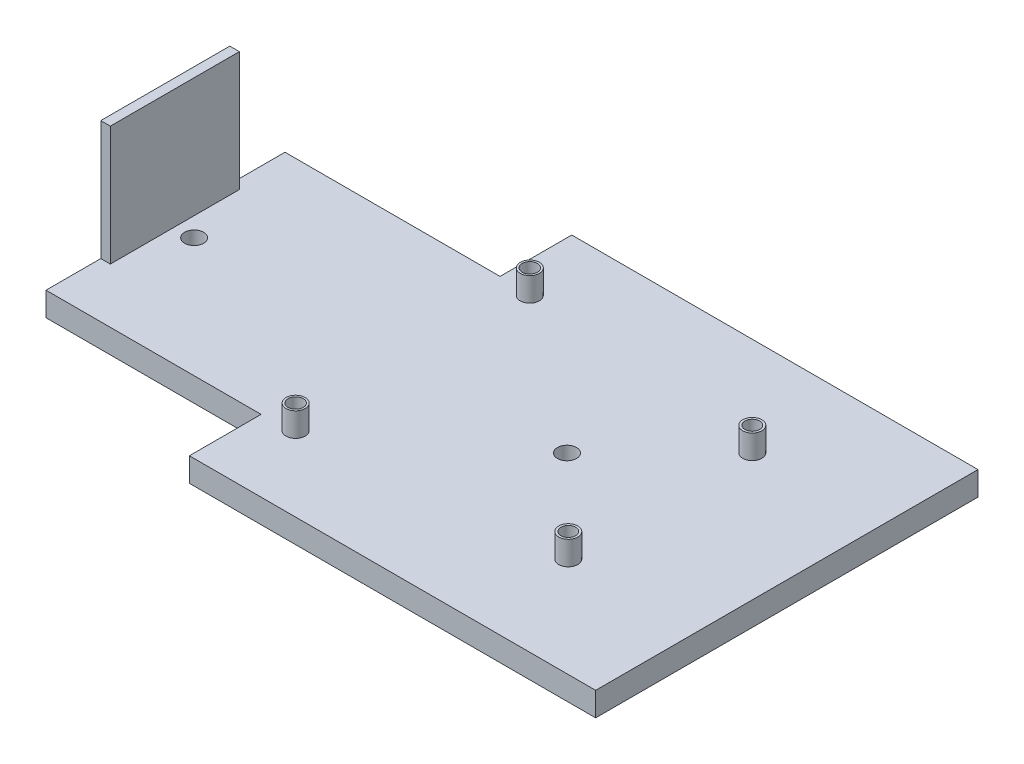
ISO-10303-21;
HEADER;
FILE_DESCRIPTION(('STEP AP214'),'2;1');
FILE_NAME('part.step','',(''),(''),'','','');
FILE_SCHEMA(('AUTOMOTIVE_DESIGN { 1 0 10303 214 1 1 1 1 }'));
ENDSEC;
DATA;
#1=APPLICATION_CONTEXT('core data for automotive mechanical design processes');
#2=APPLICATION_PROTOCOL_DEFINITION('international standard','automotive_design',2000,#1);
#3=PRODUCT_CONTEXT('',#1,'mechanical');
#4=PRODUCT('Part','Part','',(#3));
#5=PRODUCT_RELATED_PRODUCT_CATEGORY('part','',(#4));
#6=PRODUCT_DEFINITION_FORMATION('','',#4);
#7=PRODUCT_DEFINITION_CONTEXT('part definition',#1,'design');
#8=PRODUCT_DEFINITION('design','',#6,#7);
#9=PRODUCT_DEFINITION_SHAPE('','',#8);
#10=(LENGTH_UNIT() NAMED_UNIT(*) SI_UNIT(.MILLI.,.METRE.));
#11=(NAMED_UNIT(*) PLANE_ANGLE_UNIT() SI_UNIT($,.RADIAN.));
#12=(NAMED_UNIT(*) SI_UNIT($,.STERADIAN.) SOLID_ANGLE_UNIT());
#13=UNCERTAINTY_MEASURE_WITH_UNIT(LENGTH_MEASURE(1.E-05),#10,'distance_accuracy_value','');
#14=(GEOMETRIC_REPRESENTATION_CONTEXT(3) GLOBAL_UNCERTAINTY_ASSIGNED_CONTEXT((#13)) GLOBAL_UNIT_ASSIGNED_CONTEXT((#10,
#11,#12)) REPRESENTATION_CONTEXT('',''));
#15=CARTESIAN_POINT('',(0.,0.,0.));
#16=DIRECTION('',(0.,0.,1.));
#17=DIRECTION('',(1.,0.,0.));
#18=AXIS2_PLACEMENT_3D('',#15,#16,#17);
#19=CARTESIAN_POINT('',(0.,5.,0.));
#20=DIRECTION('',(0.,1.,0.));
#21=DIRECTION('',(0.,0.,1.));
#22=AXIS2_PLACEMENT_3D('',#19,#20,#21);
#23=PLANE('',#22);
#24=CARTESIAN_POINT('',(-55.2067460328945,5.,-58.3739284863577));
#25=DIRECTION('',(0.,1.,0.));
#26=DIRECTION('',(0.,0.,1.));
#27=AXIS2_PLACEMENT_3D('',#24,#25,#26);
#28=CIRCLE('',#27,2.);
#29=CARTESIAN_POINT('',(-55.2067460328945,5.,-56.3739284863577));
#30=VERTEX_POINT('',#29);
#31=EDGE_CURVE('E356',#30,#30,#28,.T.);
#32=ORIENTED_EDGE('',*,*,#31,.F.);
#33=EDGE_LOOP('',(#32));
#34=FACE_BOUND('',#33,.T.);
#35=CARTESIAN_POINT('',(-55.2067423314219,5.,-19.8739267393045));
#36=DIRECTION('',(0.,1.,0.));
#37=DIRECTION('',(0.,0.,1.));
#38=AXIS2_PLACEMENT_3D('',#35,#36,#37);
#39=CIRCLE('',#38,2.);
#40=CARTESIAN_POINT('',(-55.2067423314219,5.,-17.8739267393045));
#41=VERTEX_POINT('',#40);
#42=EDGE_CURVE('E347',#41,#41,#39,.T.);
#43=ORIENTED_EDGE('',*,*,#42,.F.);
#44=EDGE_LOOP('',(#43));
#45=FACE_BOUND('',#44,.T.);
#46=CARTESIAN_POINT('',(-107.006746211613,5.,-14.6239291819976));
#47=DIRECTION('',(0.,1.,0.));
#48=DIRECTION('',(0.,0.,1.));
#49=AXIS2_PLACEMENT_3D('',#46,#47,#48);
#50=CIRCLE('',#49,2.);
#51=CARTESIAN_POINT('',(-107.006746211613,5.,-12.6239291819976));
#52=VERTEX_POINT('',#51);
#53=EDGE_CURVE('E338',#52,#52,#50,.T.);
#54=ORIENTED_EDGE('',*,*,#53,.F.);
#55=EDGE_LOOP('',(#54));
#56=FACE_BOUND('',#55,.T.);
#57=CARTESIAN_POINT('',(-107.006745745952,5.,-63.6239297631429));
#58=DIRECTION('',(0.,1.,0.));
#59=DIRECTION('',(0.,0.,1.));
#60=AXIS2_PLACEMENT_3D('',#57,#58,#59);
#61=CIRCLE('',#60,2.);
#62=CARTESIAN_POINT('',(-107.006745745952,5.,-61.6239297631429));
#63=VERTEX_POINT('',#62);
#64=EDGE_CURVE('E328',#63,#63,#61,.T.);
#65=ORIENTED_EDGE('',*,*,#64,.F.);
#66=EDGE_LOOP('',(#65));
#67=FACE_BOUND('',#66,.T.);
#68=CARTESIAN_POINT('',(-74.5629921259843,5.,-38.9566929133858));
#69=DIRECTION('',(0.,1.,0.));
#70=DIRECTION('',(0.,0.,1.));
#71=AXIS2_PLACEMENT_3D('',#68,#69,#70);
#72=CIRCLE('',#71,2.);
#73=CARTESIAN_POINT('',(-74.5629921259843,5.,-36.9566929133858));
#74=VERTEX_POINT('',#73);
#75=EDGE_CURVE('E184',#74,#74,#72,.T.);
#76=ORIENTED_EDGE('',*,*,#75,.F.);
#77=EDGE_LOOP('',(#76));
#78=FACE_BOUND('',#77,.T.);
#79=CARTESIAN_POINT('',(-152.562992125984,5.,-38.9566929133858));
#80=DIRECTION('',(0.,1.,0.));
#81=DIRECTION('',(0.,0.,1.));
#82=AXIS2_PLACEMENT_3D('',#79,#80,#81);
#83=CIRCLE('',#82,2.);
#84=CARTESIAN_POINT('',(-152.562992125984,5.,-36.9566929133858));
#85=VERTEX_POINT('',#84);
#86=EDGE_CURVE('E275',#85,#85,#83,.T.);
#87=ORIENTED_EDGE('',*,*,#86,.F.);
#88=EDGE_LOOP('',(#87));
#89=FACE_BOUND('',#88,.T.);
#90=DIRECTION('',(0.,0.,-1.));
#91=VECTOR('',#90,1.);
#92=CARTESIAN_POINT('',(-156.562992125984,5.,-52.4126656965444));
#93=LINE('',#92,#91);
#94=CARTESIAN_POINT('',(-156.562992125984,5.,-25.4126656965444));
#95=VERTEX_POINT('',#94);
#96=CARTESIAN_POINT('',(-156.562992125984,5.,-52.4126656965444));
#97=VERTEX_POINT('',#96);
#98=EDGE_CURVE('E375',#95,#97,#93,.T.);
#99=ORIENTED_EDGE('',*,*,#98,.F.);
#100=DIRECTION('',(1.,0.,0.));
#101=VECTOR('',#100,1.);
#102=CARTESIAN_POINT('',(-156.562992125984,5.,-25.4126656965444));
#103=LINE('',#102,#101);
#104=CARTESIAN_POINT('',(-158.562992125984,5.,-25.4126656965444));
#105=VERTEX_POINT('',#104);
#106=EDGE_CURVE('E377',#105,#95,#103,.T.);
#107=ORIENTED_EDGE('',*,*,#106,.F.);
#108=DIRECTION('',(0.,0.,1.));
#109=VECTOR('',#108,1.);
#110=CARTESIAN_POINT('',(-158.562992125984,5.,-63.9566929133858));
#111=LINE('',#110,#109);
#112=CARTESIAN_POINT('',(-158.562992125984,5.,-13.9566929133858));
#113=VERTEX_POINT('',#112);
#114=EDGE_CURVE('E104',#105,#113,#111,.T.);
#115=ORIENTED_EDGE('',*,*,#114,.T.);
#116=DIRECTION('',(1.,0.,0.));
#117=VECTOR('',#116,1.);
#118=CARTESIAN_POINT('',(-158.562992125984,5.,-13.9566929133858));
#119=LINE('',#118,#117);
#120=CARTESIAN_POINT('',(-113.562992125984,5.,-13.9566929133858));
#121=VERTEX_POINT('',#120);
#122=EDGE_CURVE('E321',#113,#121,#119,.T.);
#123=ORIENTED_EDGE('',*,*,#122,.T.);
#124=DIRECTION('',(0.,0.,1.));
#125=VECTOR('',#124,1.);
#126=CARTESIAN_POINT('',(-113.562992125984,5.,1.04330708661417));
#127=LINE('',#126,#125);
#128=CARTESIAN_POINT('',(-113.562992125984,5.,1.04330708661417));
#129=VERTEX_POINT('',#128);
#130=EDGE_CURVE('E312',#121,#129,#127,.T.);
#131=ORIENTED_EDGE('',*,*,#130,.T.);
#132=DIRECTION('',(1.,0.,0.));
#133=VECTOR('',#132,1.);
#134=CARTESIAN_POINT('',(-28.5629921259842,5.,1.04330708661416));
#135=LINE('',#134,#133);
#136=CARTESIAN_POINT('',(-28.5629921259842,5.,1.04330708661416));
#137=VERTEX_POINT('',#136);
#138=EDGE_CURVE('E317',#129,#137,#135,.T.);
#139=ORIENTED_EDGE('',*,*,#138,.T.);
#140=DIRECTION('',(0.,0.,-1.));
#141=VECTOR('',#140,1.);
#142=CARTESIAN_POINT('',(-28.5629921259842,5.,-78.9566929133858));
#143=LINE('',#142,#141);
#144=CARTESIAN_POINT('',(-28.5629921259842,5.,-78.9566929133858));
#145=VERTEX_POINT('',#144);
#146=EDGE_CURVE('E128',#137,#145,#143,.T.);
#147=ORIENTED_EDGE('',*,*,#146,.T.);
#148=DIRECTION('',(-1.,0.,0.));
#149=VECTOR('',#148,1.);
#150=CARTESIAN_POINT('',(-113.562992125984,5.,-78.9566929133858));
#151=LINE('',#150,#149);
#152=CARTESIAN_POINT('',(-113.562992125984,5.,-78.9566929133858));
#153=VERTEX_POINT('',#152);
#154=EDGE_CURVE('E121',#145,#153,#151,.T.);
#155=ORIENTED_EDGE('',*,*,#154,.T.);
#156=DIRECTION('',(0.,0.,1.));
#157=VECTOR('',#156,1.);
#158=CARTESIAN_POINT('',(-113.562992125984,5.,-63.9566929133858));
#159=LINE('',#158,#157);
#160=CARTESIAN_POINT('',(-113.562992125984,5.,-63.9566929133858));
#161=VERTEX_POINT('',#160);
#162=EDGE_CURVE('E125',#153,#161,#159,.T.);
#163=ORIENTED_EDGE('',*,*,#162,.T.);
#164=DIRECTION('',(-1.,0.,0.));
#165=VECTOR('',#164,1.);
#166=CARTESIAN_POINT('',(-158.562992125984,5.,-63.9566929133858));
#167=LINE('',#166,#165);
#168=CARTESIAN_POINT('',(-158.562992125984,5.,-63.9566929133858));
#169=VERTEX_POINT('',#168);
#170=EDGE_CURVE('E63',#161,#169,#167,.T.);
#171=ORIENTED_EDGE('',*,*,#170,.T.);
#172=CARTESIAN_POINT('',(-158.562992125984,5.,-52.4126656965444));
#173=VERTEX_POINT('',#172);
#174=EDGE_CURVE('E284',#169,#173,#111,.T.);
#175=ORIENTED_EDGE('',*,*,#174,.T.);
#176=DIRECTION('',(-1.,0.,0.));
#177=VECTOR('',#176,1.);
#178=CARTESIAN_POINT('',(-158.562992125984,5.,-52.4126656965444));
#179=LINE('',#178,#177);
#180=EDGE_CURVE('E372',#97,#173,#179,.T.);
#181=ORIENTED_EDGE('',*,*,#180,.F.);
#182=EDGE_LOOP('',(#99,#107,#115,#123,#131,#139,#147,#155,#163,#171,#175,#181));
#183=FACE_BOUND('',#182,.T.);
#184=ADVANCED_FACE('F39',(#34,#45,#56,#67,#78,#89,#183),#23,.T.);
#185=CARTESIAN_POINT('',(-158.562992125984,5.,-63.9566929133858));
#186=DIRECTION('',(1.,0.,0.));
#187=DIRECTION('',(0.,0.,-1.));
#188=AXIS2_PLACEMENT_3D('',#185,#186,#187);
#189=PLANE('',#188);
#190=DIRECTION('',(0.,0.,1.));
#191=VECTOR('',#190,1.);
#192=CARTESIAN_POINT('',(-158.562992125984,0.,-63.9566929133858));
#193=LINE('',#192,#191);
#194=CARTESIAN_POINT('',(-158.562992125984,0.,-63.9566929133858));
#195=VERTEX_POINT('',#194);
#196=CARTESIAN_POINT('',(-158.562992125984,0.,-13.9566929133858));
#197=VERTEX_POINT('',#196);
#198=EDGE_CURVE('E149',#195,#197,#193,.T.);
#199=ORIENTED_EDGE('',*,*,#198,.T.);
#200=DIRECTION('',(0.,-1.,0.));
#201=VECTOR('',#200,1.);
#202=CARTESIAN_POINT('',(-158.562992125984,5.,-13.9566929133858));
#203=LINE('',#202,#201);
#204=EDGE_CURVE('E177',#113,#197,#203,.T.);
#205=ORIENTED_EDGE('',*,*,#204,.F.);
#206=ORIENTED_EDGE('',*,*,#114,.F.);
#207=DIRECTION('',(0.,-1.,0.));
#208=VECTOR('',#207,1.);
#209=CARTESIAN_POINT('',(-158.562992125984,30.,-25.4126656965444));
#210=LINE('',#209,#208);
#211=CARTESIAN_POINT('',(-158.562992125984,30.,-25.4126656965444));
#212=VERTEX_POINT('',#211);
#213=EDGE_CURVE('E360',#212,#105,#210,.T.);
#214=ORIENTED_EDGE('',*,*,#213,.F.);
#215=DIRECTION('',(0.,0.,1.));
#216=VECTOR('',#215,1.);
#217=CARTESIAN_POINT('',(-158.562992125984,30.,-25.4126656965444));
#218=LINE('',#217,#216);
#219=CARTESIAN_POINT('',(-158.562992125984,30.,-52.4126656965444));
#220=VERTEX_POINT('',#219);
#221=EDGE_CURVE('E374',#220,#212,#218,.T.);
#222=ORIENTED_EDGE('',*,*,#221,.F.);
#223=DIRECTION('',(0.,-1.,0.));
#224=VECTOR('',#223,1.);
#225=CARTESIAN_POINT('',(-158.562992125984,30.,-52.4126656965444));
#226=LINE('',#225,#224);
#227=EDGE_CURVE('E369',#220,#173,#226,.T.);
#228=ORIENTED_EDGE('',*,*,#227,.T.);
#229=ORIENTED_EDGE('',*,*,#174,.F.);
#230=DIRECTION('',(0.,-1.,0.));
#231=VECTOR('',#230,1.);
#232=CARTESIAN_POINT('',(-158.562992125984,5.,-63.9566929133858));
#233=LINE('',#232,#231);
#234=EDGE_CURVE('E145',#169,#195,#233,.T.);
#235=ORIENTED_EDGE('',*,*,#234,.T.);
#236=EDGE_LOOP('',(#199,#205,#206,#214,#222,#228,#229,#235));
#237=FACE_BOUND('',#236,.T.);
#238=ADVANCED_FACE('F41',(#237),#189,.F.);
#239=CARTESIAN_POINT('',(-158.562992125984,5.,-13.9566929133858));
#240=DIRECTION('',(0.,0.,-1.));
#241=DIRECTION('',(-1.,0.,0.));
#242=AXIS2_PLACEMENT_3D('',#239,#240,#241);
#243=PLANE('',#242);
#244=DIRECTION('',(1.,0.,0.));
#245=VECTOR('',#244,1.);
#246=CARTESIAN_POINT('',(-158.562992125984,0.,-13.9566929133858));
#247=LINE('',#246,#245);
#248=CARTESIAN_POINT('',(-113.562992125984,0.,-13.9566929133858));
#249=VERTEX_POINT('',#248);
#250=EDGE_CURVE('E152',#197,#249,#247,.T.);
#251=ORIENTED_EDGE('',*,*,#250,.T.);
#252=DIRECTION('',(0.,-1.,0.));
#253=VECTOR('',#252,1.);
#254=CARTESIAN_POINT('',(-113.562992125984,5.,-13.9566929133858));
#255=LINE('',#254,#253);
#256=EDGE_CURVE('E174',#121,#249,#255,.T.);
#257=ORIENTED_EDGE('',*,*,#256,.F.);
#258=ORIENTED_EDGE('',*,*,#122,.F.);
#259=ORIENTED_EDGE('',*,*,#204,.T.);
#260=EDGE_LOOP('',(#251,#257,#258,#259));
#261=FACE_BOUND('',#260,.T.);
#262=ADVANCED_FACE('F228',(#261),#243,.F.);
#263=CARTESIAN_POINT('',(-113.562992125984,5.,1.04330708661417));
#264=DIRECTION('',(1.,0.,0.));
#265=DIRECTION('',(0.,0.,-1.));
#266=AXIS2_PLACEMENT_3D('',#263,#264,#265);
#267=PLANE('',#266);
#268=DIRECTION('',(0.,0.,1.));
#269=VECTOR('',#268,1.);
#270=CARTESIAN_POINT('',(-113.562992125984,0.,1.04330708661417));
#271=LINE('',#270,#269);
#272=CARTESIAN_POINT('',(-113.562992125984,0.,1.04330708661417));
#273=VERTEX_POINT('',#272);
#274=EDGE_CURVE('E155',#249,#273,#271,.T.);
#275=ORIENTED_EDGE('',*,*,#274,.T.);
#276=DIRECTION('',(0.,-1.,0.));
#277=VECTOR('',#276,1.);
#278=CARTESIAN_POINT('',(-113.562992125984,5.,1.04330708661417));
#279=LINE('',#278,#277);
#280=EDGE_CURVE('E171',#129,#273,#279,.T.);
#281=ORIENTED_EDGE('',*,*,#280,.F.);
#282=ORIENTED_EDGE('',*,*,#130,.F.);
#283=ORIENTED_EDGE('',*,*,#256,.T.);
#284=EDGE_LOOP('',(#275,#281,#282,#283));
#285=FACE_BOUND('',#284,.T.);
#286=ADVANCED_FACE('F301',(#285),#267,.F.);
#287=CARTESIAN_POINT('',(-28.5629921259842,5.,1.04330708661416));
#288=DIRECTION('',(0.,0.,-1.));
#289=DIRECTION('',(-1.,0.,0.));
#290=AXIS2_PLACEMENT_3D('',#287,#288,#289);
#291=PLANE('',#290);
#292=DIRECTION('',(1.,0.,0.));
#293=VECTOR('',#292,1.);
#294=CARTESIAN_POINT('',(-28.5629921259842,0.,1.04330708661416));
#295=LINE('',#294,#293);
#296=CARTESIAN_POINT('',(-28.5629921259842,0.,1.04330708661416));
#297=VERTEX_POINT('',#296);
#298=EDGE_CURVE('E157',#273,#297,#295,.T.);
#299=ORIENTED_EDGE('',*,*,#298,.T.);
#300=DIRECTION('',(0.,-1.,0.));
#301=VECTOR('',#300,1.);
#302=CARTESIAN_POINT('',(-28.5629921259842,5.,1.04330708661416));
#303=LINE('',#302,#301);
#304=EDGE_CURVE('E168',#137,#297,#303,.T.);
#305=ORIENTED_EDGE('',*,*,#304,.F.);
#306=ORIENTED_EDGE('',*,*,#138,.F.);
#307=ORIENTED_EDGE('',*,*,#280,.T.);
#308=EDGE_LOOP('',(#299,#305,#306,#307));
#309=FACE_BOUND('',#308,.T.);
#310=ADVANCED_FACE('F297',(#309),#291,.F.);
#311=CARTESIAN_POINT('',(-28.5629921259842,5.,-78.9566929133858));
#312=DIRECTION('',(-1.,0.,0.));
#313=DIRECTION('',(0.,0.,1.));
#314=AXIS2_PLACEMENT_3D('',#311,#312,#313);
#315=PLANE('',#314);
#316=DIRECTION('',(0.,0.,-1.));
#317=VECTOR('',#316,1.);
#318=CARTESIAN_POINT('',(-28.5629921259842,0.,-78.9566929133858));
#319=LINE('',#318,#317);
#320=CARTESIAN_POINT('',(-28.5629921259842,0.,-78.9566929133858));
#321=VERTEX_POINT('',#320);
#322=EDGE_CURVE('E159',#297,#321,#319,.T.);
#323=ORIENTED_EDGE('',*,*,#322,.T.);
#324=DIRECTION('',(0.,-1.,0.));
#325=VECTOR('',#324,1.);
#326=CARTESIAN_POINT('',(-28.5629921259842,5.,-78.9566929133858));
#327=LINE('',#326,#325);
#328=EDGE_CURVE('E140',#145,#321,#327,.T.);
#329=ORIENTED_EDGE('',*,*,#328,.F.);
#330=ORIENTED_EDGE('',*,*,#146,.F.);
#331=ORIENTED_EDGE('',*,*,#304,.T.);
#332=EDGE_LOOP('',(#323,#329,#330,#331));
#333=FACE_BOUND('',#332,.T.);
#334=ADVANCED_FACE('F294',(#333),#315,.F.);
#335=CARTESIAN_POINT('',(-113.562992125984,5.,-78.9566929133858));
#336=DIRECTION('',(0.,0.,1.));
#337=DIRECTION('',(1.,0.,0.));
#338=AXIS2_PLACEMENT_3D('',#335,#336,#337);
#339=PLANE('',#338);
#340=DIRECTION('',(-1.,0.,0.));
#341=VECTOR('',#340,1.);
#342=CARTESIAN_POINT('',(-113.562992125984,0.,-78.9566929133858));
#343=LINE('',#342,#341);
#344=CARTESIAN_POINT('',(-113.562992125984,0.,-78.9566929133858));
#345=VERTEX_POINT('',#344);
#346=EDGE_CURVE('E137',#321,#345,#343,.T.);
#347=ORIENTED_EDGE('',*,*,#346,.T.);
#348=DIRECTION('',(0.,-1.,0.));
#349=VECTOR('',#348,1.);
#350=CARTESIAN_POINT('',(-113.562992125984,5.,-78.9566929133858));
#351=LINE('',#350,#349);
#352=EDGE_CURVE('E134',#153,#345,#351,.T.);
#353=ORIENTED_EDGE('',*,*,#352,.F.);
#354=ORIENTED_EDGE('',*,*,#154,.F.);
#355=ORIENTED_EDGE('',*,*,#328,.T.);
#356=EDGE_LOOP('',(#347,#353,#354,#355));
#357=FACE_BOUND('',#356,.T.);
#358=ADVANCED_FACE('F135',(#357),#339,.F.);
#359=CARTESIAN_POINT('',(-113.562992125984,5.,-63.9566929133858));
#360=DIRECTION('',(1.,0.,0.));
#361=DIRECTION('',(0.,0.,-1.));
#362=AXIS2_PLACEMENT_3D('',#359,#360,#361);
#363=PLANE('',#362);
#364=DIRECTION('',(0.,0.,1.));
#365=VECTOR('',#364,1.);
#366=CARTESIAN_POINT('',(-113.562992125984,0.,-63.9566929133858));
#367=LINE('',#366,#365);
#368=CARTESIAN_POINT('',(-113.562992125984,0.,-63.9566929133858));
#369=VERTEX_POINT('',#368);
#370=EDGE_CURVE('E162',#345,#369,#367,.T.);
#371=ORIENTED_EDGE('',*,*,#370,.T.);
#372=DIRECTION('',(0.,-1.,0.));
#373=VECTOR('',#372,1.);
#374=CARTESIAN_POINT('',(-113.562992125984,5.,-63.9566929133858));
#375=LINE('',#374,#373);
#376=EDGE_CURVE('E141',#161,#369,#375,.T.);
#377=ORIENTED_EDGE('',*,*,#376,.F.);
#378=ORIENTED_EDGE('',*,*,#162,.F.);
#379=ORIENTED_EDGE('',*,*,#352,.T.);
#380=EDGE_LOOP('',(#371,#377,#378,#379));
#381=FACE_BOUND('',#380,.T.);
#382=ADVANCED_FACE('F143',(#381),#363,.F.);
#383=CARTESIAN_POINT('',(-158.562992125984,5.,-63.9566929133858));
#384=DIRECTION('',(0.,0.,1.));
#385=DIRECTION('',(1.,0.,0.));
#386=AXIS2_PLACEMENT_3D('',#383,#384,#385);
#387=PLANE('',#386);
#388=DIRECTION('',(-1.,0.,0.));
#389=VECTOR('',#388,1.);
#390=CARTESIAN_POINT('',(-158.562992125984,0.,-63.9566929133858));
#391=LINE('',#390,#389);
#392=EDGE_CURVE('E96',#369,#195,#391,.T.);
#393=ORIENTED_EDGE('',*,*,#392,.T.);
#394=ORIENTED_EDGE('',*,*,#234,.F.);
#395=ORIENTED_EDGE('',*,*,#170,.F.);
#396=ORIENTED_EDGE('',*,*,#376,.T.);
#397=EDGE_LOOP('',(#393,#394,#395,#396));
#398=FACE_BOUND('',#397,.T.);
#399=ADVANCED_FACE('F270',(#398),#387,.F.);
#400=CARTESIAN_POINT('',(0.,0.,0.));
#401=DIRECTION('',(0.,1.,0.));
#402=DIRECTION('',(0.,0.,1.));
#403=AXIS2_PLACEMENT_3D('',#400,#401,#402);
#404=PLANE('',#403);
#405=CARTESIAN_POINT('',(-74.5629921259843,0.,-38.9566929133858));
#406=DIRECTION('',(0.,1.,0.));
#407=DIRECTION('',(0.,0.,1.));
#408=AXIS2_PLACEMENT_3D('',#405,#406,#407);
#409=CIRCLE('',#408,2.);
#410=CARTESIAN_POINT('',(-74.5629921259843,0.,-36.9566929133858));
#411=VERTEX_POINT('',#410);
#412=EDGE_CURVE('E153',#411,#411,#409,.T.);
#413=ORIENTED_EDGE('',*,*,#412,.T.);
#414=EDGE_LOOP('',(#413));
#415=FACE_BOUND('',#414,.T.);
#416=CARTESIAN_POINT('',(-152.562992125984,0.,-38.9566929133858));
#417=DIRECTION('',(0.,1.,0.));
#418=DIRECTION('',(0.,0.,1.));
#419=AXIS2_PLACEMENT_3D('',#416,#417,#418);
#420=CIRCLE('',#419,2.);
#421=CARTESIAN_POINT('',(-152.562992125984,0.,-36.9566929133858));
#422=VERTEX_POINT('',#421);
#423=EDGE_CURVE('E181',#422,#422,#420,.T.);
#424=ORIENTED_EDGE('',*,*,#423,.T.);
#425=EDGE_LOOP('',(#424));
#426=FACE_BOUND('',#425,.T.);
#427=ORIENTED_EDGE('',*,*,#198,.F.);
#428=ORIENTED_EDGE('',*,*,#392,.F.);
#429=ORIENTED_EDGE('',*,*,#370,.F.);
#430=ORIENTED_EDGE('',*,*,#346,.F.);
#431=ORIENTED_EDGE('',*,*,#322,.F.);
#432=ORIENTED_EDGE('',*,*,#298,.F.);
#433=ORIENTED_EDGE('',*,*,#274,.F.);
#434=ORIENTED_EDGE('',*,*,#250,.F.);
#435=EDGE_LOOP('',(#427,#428,#429,#430,#431,#432,#433,#434));
#436=FACE_BOUND('',#435,.T.);
#437=ADVANCED_FACE('F265',(#415,#426,#436),#404,.F.);
#438=CARTESIAN_POINT('',(-152.562992125984,-13.,-38.9566929133858));
#439=DIRECTION('',(0.,1.,0.));
#440=DIRECTION('',(0.,0.,1.));
#441=AXIS2_PLACEMENT_3D('',#438,#439,#440);
#442=CYLINDRICAL_SURFACE('',#441,2.);
#443=ORIENTED_EDGE('',*,*,#86,.T.);
#444=EDGE_LOOP('',(#443));
#445=FACE_BOUND('',#444,.T.);
#446=ORIENTED_EDGE('',*,*,#423,.F.);
#447=EDGE_LOOP('',(#446));
#448=FACE_BOUND('',#447,.T.);
#449=ADVANCED_FACE('F262',(#445,#448),#442,.F.);
#450=CARTESIAN_POINT('',(-74.5629921259843,-13.,-38.9566929133858));
#451=DIRECTION('',(0.,1.,0.));
#452=DIRECTION('',(0.,0.,1.));
#453=AXIS2_PLACEMENT_3D('',#450,#451,#452);
#454=CYLINDRICAL_SURFACE('',#453,2.);
#455=ORIENTED_EDGE('',*,*,#75,.T.);
#456=EDGE_LOOP('',(#455));
#457=FACE_BOUND('',#456,.T.);
#458=ORIENTED_EDGE('',*,*,#412,.F.);
#459=EDGE_LOOP('',(#458));
#460=FACE_BOUND('',#459,.T.);
#461=ADVANCED_FACE('F258',(#457,#460),#454,.F.);
#462=CARTESIAN_POINT('',(-107.006745745952,10.,-63.6239297631429));
#463=DIRECTION('',(0.,1.,0.));
#464=DIRECTION('',(0.,0.,1.));
#465=AXIS2_PLACEMENT_3D('',#462,#463,#464);
#466=PLANE('',#465);
#467=CARTESIAN_POINT('',(-107.006745745952,10.,-63.6239297631429));
#468=DIRECTION('',(0.,1.,0.));
#469=DIRECTION('',(0.,0.,1.));
#470=AXIS2_PLACEMENT_3D('',#467,#468,#469);
#471=CIRCLE('',#470,2.);
#472=CARTESIAN_POINT('',(-107.006745745952,10.,-61.6239297631429));
#473=VERTEX_POINT('',#472);
#474=EDGE_CURVE('E325',#473,#473,#471,.T.);
#475=ORIENTED_EDGE('',*,*,#474,.T.);
#476=EDGE_LOOP('',(#475));
#477=FACE_BOUND('',#476,.T.);
#478=CARTESIAN_POINT('',(-107.006745745952,10.,-63.6239297631429));
#479=DIRECTION('',(0.,1.,0.));
#480=DIRECTION('',(0.,0.,1.));
#481=AXIS2_PLACEMENT_3D('',#478,#479,#480);
#482=CIRCLE('',#481,1.59614806761965);
#483=CARTESIAN_POINT('',(-107.006745745952,10.,-62.0277816955232));
#484=VERTEX_POINT('',#483);
#485=EDGE_CURVE('E331',#484,#484,#482,.T.);
#486=ORIENTED_EDGE('',*,*,#485,.F.);
#487=EDGE_LOOP('',(#486));
#488=FACE_BOUND('',#487,.T.);
#489=ADVANCED_FACE('F251',(#477,#488),#466,.T.);
#490=CARTESIAN_POINT('',(-107.006745745952,10.,-63.6239297631429));
#491=DIRECTION('',(0.,-1.,0.));
#492=DIRECTION('',(0.,0.,-1.));
#493=AXIS2_PLACEMENT_3D('',#490,#491,#492);
#494=CYLINDRICAL_SURFACE('',#493,2.);
#495=ORIENTED_EDGE('',*,*,#474,.F.);
#496=EDGE_LOOP('',(#495));
#497=FACE_BOUND('',#496,.T.);
#498=ORIENTED_EDGE('',*,*,#64,.T.);
#499=EDGE_LOOP('',(#498));
#500=FACE_BOUND('',#499,.T.);
#501=ADVANCED_FACE('F243',(#497,#500),#494,.T.);
#502=CARTESIAN_POINT('',(-107.006745745952,10.,-63.6239297631429));
#503=DIRECTION('',(0.,-1.,0.));
#504=DIRECTION('',(0.,0.,-1.));
#505=AXIS2_PLACEMENT_3D('',#502,#503,#504);
#506=CYLINDRICAL_SURFACE('',#505,1.59614806761965);
#507=ORIENTED_EDGE('',*,*,#485,.T.);
#508=EDGE_LOOP('',(#507));
#509=FACE_BOUND('',#508,.T.);
#510=CARTESIAN_POINT('',(-107.006745745952,5.,-63.6239297631429));
#511=DIRECTION('',(0.,1.,0.));
#512=DIRECTION('',(0.,0.,1.));
#513=AXIS2_PLACEMENT_3D('',#510,#511,#512);
#514=CIRCLE('',#513,1.59614806761965);
#515=CARTESIAN_POINT('',(-107.006745745952,5.,-62.0277816955232));
#516=VERTEX_POINT('',#515);
#517=EDGE_CURVE('E180',#516,#516,#514,.F.);
#518=ORIENTED_EDGE('',*,*,#517,.T.);
#519=EDGE_LOOP('',(#518));
#520=FACE_BOUND('',#519,.T.);
#521=ADVANCED_FACE('F234',(#509,#520),#506,.F.);
#522=ORIENTED_EDGE('',*,*,#517,.F.);
#523=EDGE_LOOP('',(#522));
#524=FACE_BOUND('',#523,.T.);
#525=ADVANCED_FACE('F218',(#524),#23,.T.);
#526=CARTESIAN_POINT('',(-107.006746211613,10.,-14.6239291819976));
#527=DIRECTION('',(0.,1.,0.));
#528=DIRECTION('',(0.,0.,1.));
#529=AXIS2_PLACEMENT_3D('',#526,#527,#528);
#530=PLANE('',#529);
#531=CARTESIAN_POINT('',(-107.006746211613,10.,-14.6239291819976));
#532=DIRECTION('',(0.,1.,0.));
#533=DIRECTION('',(0.,0.,1.));
#534=AXIS2_PLACEMENT_3D('',#531,#532,#533);
#535=CIRCLE('',#534,2.);
#536=CARTESIAN_POINT('',(-107.006746211613,10.,-12.6239291819976));
#537=VERTEX_POINT('',#536);
#538=EDGE_CURVE('E339',#537,#537,#535,.T.);
#539=ORIENTED_EDGE('',*,*,#538,.T.);
#540=EDGE_LOOP('',(#539));
#541=FACE_BOUND('',#540,.T.);
#542=CARTESIAN_POINT('',(-107.006746211613,10.,-14.6239291819976));
#543=DIRECTION('',(0.,1.,0.));
#544=DIRECTION('',(0.,0.,1.));
#545=AXIS2_PLACEMENT_3D('',#542,#543,#544);
#546=CIRCLE('',#545,1.5961527156674);
#547=CARTESIAN_POINT('',(-107.006746211613,10.,-13.0277764663302));
#548=VERTEX_POINT('',#547);
#549=EDGE_CURVE('E335',#548,#548,#546,.T.);
#550=ORIENTED_EDGE('',*,*,#549,.F.);
#551=EDGE_LOOP('',(#550));
#552=FACE_BOUND('',#551,.T.);
#553=ADVANCED_FACE('F233',(#541,#552),#530,.T.);
#554=CARTESIAN_POINT('',(-107.006746211613,10.,-14.6239291819976));
#555=DIRECTION('',(0.,-1.,0.));
#556=DIRECTION('',(0.,0.,-1.));
#557=AXIS2_PLACEMENT_3D('',#554,#555,#556);
#558=CYLINDRICAL_SURFACE('',#557,2.);
#559=ORIENTED_EDGE('',*,*,#538,.F.);
#560=EDGE_LOOP('',(#559));
#561=FACE_BOUND('',#560,.T.);
#562=ORIENTED_EDGE('',*,*,#53,.T.);
#563=EDGE_LOOP('',(#562));
#564=FACE_BOUND('',#563,.T.);
#565=ADVANCED_FACE('F240',(#561,#564),#558,.T.);
#566=CARTESIAN_POINT('',(-107.006746211613,10.,-14.6239291819976));
#567=DIRECTION('',(0.,-1.,0.));
#568=DIRECTION('',(0.,0.,-1.));
#569=AXIS2_PLACEMENT_3D('',#566,#567,#568);
#570=CYLINDRICAL_SURFACE('',#569,1.5961527156674);
#571=ORIENTED_EDGE('',*,*,#549,.T.);
#572=EDGE_LOOP('',(#571));
#573=FACE_BOUND('',#572,.T.);
#574=CARTESIAN_POINT('',(-107.006746211613,5.,-14.6239291819976));
#575=DIRECTION('',(0.,1.,0.));
#576=DIRECTION('',(0.,0.,1.));
#577=AXIS2_PLACEMENT_3D('',#574,#575,#576);
#578=CIRCLE('',#577,1.5961527156674);
#579=CARTESIAN_POINT('',(-107.006746211613,5.,-13.0277764663302));
#580=VERTEX_POINT('',#579);
#581=EDGE_CURVE('E189',#580,#580,#578,.F.);
#582=ORIENTED_EDGE('',*,*,#581,.T.);
#583=EDGE_LOOP('',(#582));
#584=FACE_BOUND('',#583,.T.);
#585=ADVANCED_FACE('F216',(#573,#584),#570,.F.);
#586=ORIENTED_EDGE('',*,*,#581,.F.);
#587=EDGE_LOOP('',(#586));
#588=FACE_BOUND('',#587,.T.);
#589=ADVANCED_FACE('F200',(#588),#23,.T.);
#590=CARTESIAN_POINT('',(-55.2067423314219,10.,-19.8739267393045));
#591=DIRECTION('',(0.,1.,0.));
#592=DIRECTION('',(0.,0.,1.));
#593=AXIS2_PLACEMENT_3D('',#590,#591,#592);
#594=PLANE('',#593);
#595=CARTESIAN_POINT('',(-55.2067423314219,10.,-19.8739267393045));
#596=DIRECTION('',(0.,1.,0.));
#597=DIRECTION('',(0.,0.,1.));
#598=AXIS2_PLACEMENT_3D('',#595,#596,#597);
#599=CIRCLE('',#598,2.);
#600=CARTESIAN_POINT('',(-55.2067423314219,10.,-17.8739267393045));
#601=VERTEX_POINT('',#600);
#602=EDGE_CURVE('E348',#601,#601,#599,.T.);
#603=ORIENTED_EDGE('',*,*,#602,.T.);
#604=EDGE_LOOP('',(#603));
#605=FACE_BOUND('',#604,.T.);
#606=CARTESIAN_POINT('',(-55.2067423314219,10.,-19.8739267393045));
#607=DIRECTION('',(0.,1.,0.));
#608=DIRECTION('',(0.,0.,1.));
#609=AXIS2_PLACEMENT_3D('',#606,#607,#608);
#610=CIRCLE('',#609,1.54626817493413);
#611=CARTESIAN_POINT('',(-55.2067423314219,10.,-18.3276585643704));
#612=VERTEX_POINT('',#611);
#613=EDGE_CURVE('E342',#612,#612,#610,.T.);
#614=ORIENTED_EDGE('',*,*,#613,.F.);
#615=EDGE_LOOP('',(#614));
#616=FACE_BOUND('',#615,.T.);
#617=ADVANCED_FACE('F215',(#605,#616),#594,.T.);
#618=CARTESIAN_POINT('',(-55.2067423314219,10.,-19.8739267393045));
#619=DIRECTION('',(0.,-1.,0.));
#620=DIRECTION('',(0.,0.,-1.));
#621=AXIS2_PLACEMENT_3D('',#618,#619,#620);
#622=CYLINDRICAL_SURFACE('',#621,2.);
#623=ORIENTED_EDGE('',*,*,#602,.F.);
#624=EDGE_LOOP('',(#623));
#625=FACE_BOUND('',#624,.T.);
#626=ORIENTED_EDGE('',*,*,#42,.T.);
#627=EDGE_LOOP('',(#626));
#628=FACE_BOUND('',#627,.T.);
#629=ADVANCED_FACE('F209',(#625,#628),#622,.T.);
#630=CARTESIAN_POINT('',(-55.2067423314219,10.,-19.8739267393045));
#631=DIRECTION('',(0.,-1.,0.));
#632=DIRECTION('',(0.,0.,-1.));
#633=AXIS2_PLACEMENT_3D('',#630,#631,#632);
#634=CYLINDRICAL_SURFACE('',#633,1.54626817493413);
#635=ORIENTED_EDGE('',*,*,#613,.T.);
#636=EDGE_LOOP('',(#635));
#637=FACE_BOUND('',#636,.T.);
#638=CARTESIAN_POINT('',(-55.2067423314219,5.,-19.8739267393045));
#639=DIRECTION('',(0.,1.,0.));
#640=DIRECTION('',(0.,0.,1.));
#641=AXIS2_PLACEMENT_3D('',#638,#639,#640);
#642=CIRCLE('',#641,1.54626817493413);
#643=CARTESIAN_POINT('',(-55.2067423314219,5.,-18.3276585643704));
#644=VERTEX_POINT('',#643);
#645=EDGE_CURVE('E47',#644,#644,#642,.F.);
#646=ORIENTED_EDGE('',*,*,#645,.T.);
#647=EDGE_LOOP('',(#646));
#648=FACE_BOUND('',#647,.T.);
#649=ADVANCED_FACE('F194',(#637,#648),#634,.F.);
#650=ORIENTED_EDGE('',*,*,#645,.F.);
#651=EDGE_LOOP('',(#650));
#652=FACE_BOUND('',#651,.T.);
#653=ADVANCED_FACE('F196',(#652),#23,.T.);
#654=CARTESIAN_POINT('',(-55.2067460328945,10.,-58.3739284863577));
#655=DIRECTION('',(0.,1.,0.));
#656=DIRECTION('',(0.,0.,1.));
#657=AXIS2_PLACEMENT_3D('',#654,#655,#656);
#658=PLANE('',#657);
#659=CARTESIAN_POINT('',(-55.2067460328945,10.,-58.3739284863577));
#660=DIRECTION('',(0.,1.,0.));
#661=DIRECTION('',(0.,0.,1.));
#662=AXIS2_PLACEMENT_3D('',#659,#660,#661);
#663=CIRCLE('',#662,2.);
#664=CARTESIAN_POINT('',(-55.2067460328945,10.,-56.3739284863577));
#665=VERTEX_POINT('',#664);
#666=EDGE_CURVE('E357',#665,#665,#663,.T.);
#667=ORIENTED_EDGE('',*,*,#666,.T.);
#668=EDGE_LOOP('',(#667));
#669=FACE_BOUND('',#668,.T.);
#670=CARTESIAN_POINT('',(-55.2067460328945,10.,-58.3739284863577));
#671=DIRECTION('',(0.,1.,0.));
#672=DIRECTION('',(0.,0.,1.));
#673=AXIS2_PLACEMENT_3D('',#670,#671,#672);
#674=CIRCLE('',#673,1.5462726705363);
#675=CARTESIAN_POINT('',(-55.2067460328945,10.,-56.8276558158214));
#676=VERTEX_POINT('',#675);
#677=EDGE_CURVE('E351',#676,#676,#674,.T.);
#678=ORIENTED_EDGE('',*,*,#677,.F.);
#679=EDGE_LOOP('',(#678));
#680=FACE_BOUND('',#679,.T.);
#681=ADVANCED_FACE('F198',(#669,#680),#658,.T.);
#682=CARTESIAN_POINT('',(-55.2067460328945,10.,-58.3739284863577));
#683=DIRECTION('',(0.,-1.,0.));
#684=DIRECTION('',(0.,0.,-1.));
#685=AXIS2_PLACEMENT_3D('',#682,#683,#684);
#686=CYLINDRICAL_SURFACE('',#685,2.);
#687=ORIENTED_EDGE('',*,*,#666,.F.);
#688=EDGE_LOOP('',(#687));
#689=FACE_BOUND('',#688,.T.);
#690=ORIENTED_EDGE('',*,*,#31,.T.);
#691=EDGE_LOOP('',(#690));
#692=FACE_BOUND('',#691,.T.);
#693=ADVANCED_FACE('F206',(#689,#692),#686,.T.);
#694=CARTESIAN_POINT('',(-55.2067460328945,10.,-58.3739284863577));
#695=DIRECTION('',(0.,-1.,0.));
#696=DIRECTION('',(0.,0.,-1.));
#697=AXIS2_PLACEMENT_3D('',#694,#695,#696);
#698=CYLINDRICAL_SURFACE('',#697,1.5462726705363);
#699=ORIENTED_EDGE('',*,*,#677,.T.);
#700=EDGE_LOOP('',(#699));
#701=FACE_BOUND('',#700,.T.);
#702=CARTESIAN_POINT('',(-55.2067460328945,5.,-58.3739284863577));
#703=DIRECTION('',(0.,1.,0.));
#704=DIRECTION('',(0.,0.,1.));
#705=AXIS2_PLACEMENT_3D('',#702,#703,#704);
#706=CIRCLE('',#705,1.5462726705363);
#707=CARTESIAN_POINT('',(-55.2067460328945,5.,-56.8276558158214));
#708=VERTEX_POINT('',#707);
#709=EDGE_CURVE('E11',#708,#708,#706,.F.);
#710=ORIENTED_EDGE('',*,*,#709,.T.);
#711=EDGE_LOOP('',(#710));
#712=FACE_BOUND('',#711,.T.);
#713=ADVANCED_FACE('F221',(#701,#712),#698,.F.);
#714=ORIENTED_EDGE('',*,*,#709,.F.);
#715=EDGE_LOOP('',(#714));
#716=FACE_BOUND('',#715,.T.);
#717=ADVANCED_FACE('F201',(#716),#23,.T.);
#718=CARTESIAN_POINT('',(-156.562992125984,30.,-25.4126656965444));
#719=DIRECTION('',(0.,0.,-1.));
#720=DIRECTION('',(-1.,0.,0.));
#721=AXIS2_PLACEMENT_3D('',#718,#719,#720);
#722=PLANE('',#721);
#723=ORIENTED_EDGE('',*,*,#106,.T.);
#724=DIRECTION('',(0.,-1.,0.));
#725=VECTOR('',#724,1.);
#726=CARTESIAN_POINT('',(-156.562992125984,30.,-25.4126656965444));
#727=LINE('',#726,#725);
#728=CARTESIAN_POINT('',(-156.562992125984,30.,-25.4126656965444));
#729=VERTEX_POINT('',#728);
#730=EDGE_CURVE('E365',#729,#95,#727,.T.);
#731=ORIENTED_EDGE('',*,*,#730,.F.);
#732=DIRECTION('',(1.,0.,0.));
#733=VECTOR('',#732,1.);
#734=CARTESIAN_POINT('',(-156.562992125984,30.,-25.4126656965444));
#735=LINE('',#734,#733);
#736=EDGE_CURVE('E385',#212,#729,#735,.T.);
#737=ORIENTED_EDGE('',*,*,#736,.F.);
#738=ORIENTED_EDGE('',*,*,#213,.T.);
#739=EDGE_LOOP('',(#723,#731,#737,#738));
#740=FACE_BOUND('',#739,.T.);
#741=ADVANCED_FACE('F220',(#740),#722,.F.);
#742=CARTESIAN_POINT('',(-156.562992125984,30.,-52.4126656965444));
#743=DIRECTION('',(-1.,0.,0.));
#744=DIRECTION('',(0.,0.,1.));
#745=AXIS2_PLACEMENT_3D('',#742,#743,#744);
#746=PLANE('',#745);
#747=ORIENTED_EDGE('',*,*,#98,.T.);
#748=DIRECTION('',(0.,-1.,0.));
#749=VECTOR('',#748,1.);
#750=CARTESIAN_POINT('',(-156.562992125984,30.,-52.4126656965444));
#751=LINE('',#750,#749);
#752=CARTESIAN_POINT('',(-156.562992125984,30.,-52.4126656965444));
#753=VERTEX_POINT('',#752);
#754=EDGE_CURVE('E54',#753,#97,#751,.T.);
#755=ORIENTED_EDGE('',*,*,#754,.F.);
#756=DIRECTION('',(0.,0.,-1.));
#757=VECTOR('',#756,1.);
#758=CARTESIAN_POINT('',(-156.562992125984,30.,-52.4126656965444));
#759=LINE('',#758,#757);
#760=EDGE_CURVE('E382',#729,#753,#759,.T.);
#761=ORIENTED_EDGE('',*,*,#760,.F.);
#762=ORIENTED_EDGE('',*,*,#730,.T.);
#763=EDGE_LOOP('',(#747,#755,#761,#762));
#764=FACE_BOUND('',#763,.T.);
#765=ADVANCED_FACE('F405',(#764),#746,.F.);
#766=CARTESIAN_POINT('',(-158.562992125984,30.,-52.4126656965444));
#767=DIRECTION('',(0.,0.,1.));
#768=DIRECTION('',(1.,0.,0.));
#769=AXIS2_PLACEMENT_3D('',#766,#767,#768);
#770=PLANE('',#769);
#771=ORIENTED_EDGE('',*,*,#180,.T.);
#772=ORIENTED_EDGE('',*,*,#227,.F.);
#773=DIRECTION('',(-1.,0.,0.));
#774=VECTOR('',#773,1.);
#775=CARTESIAN_POINT('',(-158.562992125984,30.,-52.4126656965444));
#776=LINE('',#775,#774);
#777=EDGE_CURVE('E371',#753,#220,#776,.T.);
#778=ORIENTED_EDGE('',*,*,#777,.F.);
#779=ORIENTED_EDGE('',*,*,#754,.T.);
#780=EDGE_LOOP('',(#771,#772,#778,#779));
#781=FACE_BOUND('',#780,.T.);
#782=ADVANCED_FACE('F411',(#781),#770,.F.);
#783=CARTESIAN_POINT('',(0.,30.,0.));
#784=DIRECTION('',(0.,-1.,0.));
#785=DIRECTION('',(0.,0.,-1.));
#786=AXIS2_PLACEMENT_3D('',#783,#784,#785);
#787=PLANE('',#786);
#788=ORIENTED_EDGE('',*,*,#221,.T.);
#789=ORIENTED_EDGE('',*,*,#736,.T.);
#790=ORIENTED_EDGE('',*,*,#760,.T.);
#791=ORIENTED_EDGE('',*,*,#777,.T.);
#792=EDGE_LOOP('',(#788,#789,#790,#791));
#793=FACE_BOUND('',#792,.T.);
#794=ADVANCED_FACE('F393',(#793),#787,.F.);
#795=CLOSED_SHELL('',(#184,#238,#262,#286,#310,#334,#358,#382,#399,#437,#449,#461,#489,#501,
#521,#525,#553,#565,#585,#589,#617,#629,#649,#653,#681,#693,#713,#717,#741,#765,#782,#794));
#796=MANIFOLD_SOLID_BREP('B2',#795);
#797=ADVANCED_BREP_SHAPE_REPRESENTATION('',(#18,#796),#14);
#798=SHAPE_DEFINITION_REPRESENTATION(#9,#797);
ENDSEC;
END-ISO-10303-21;
